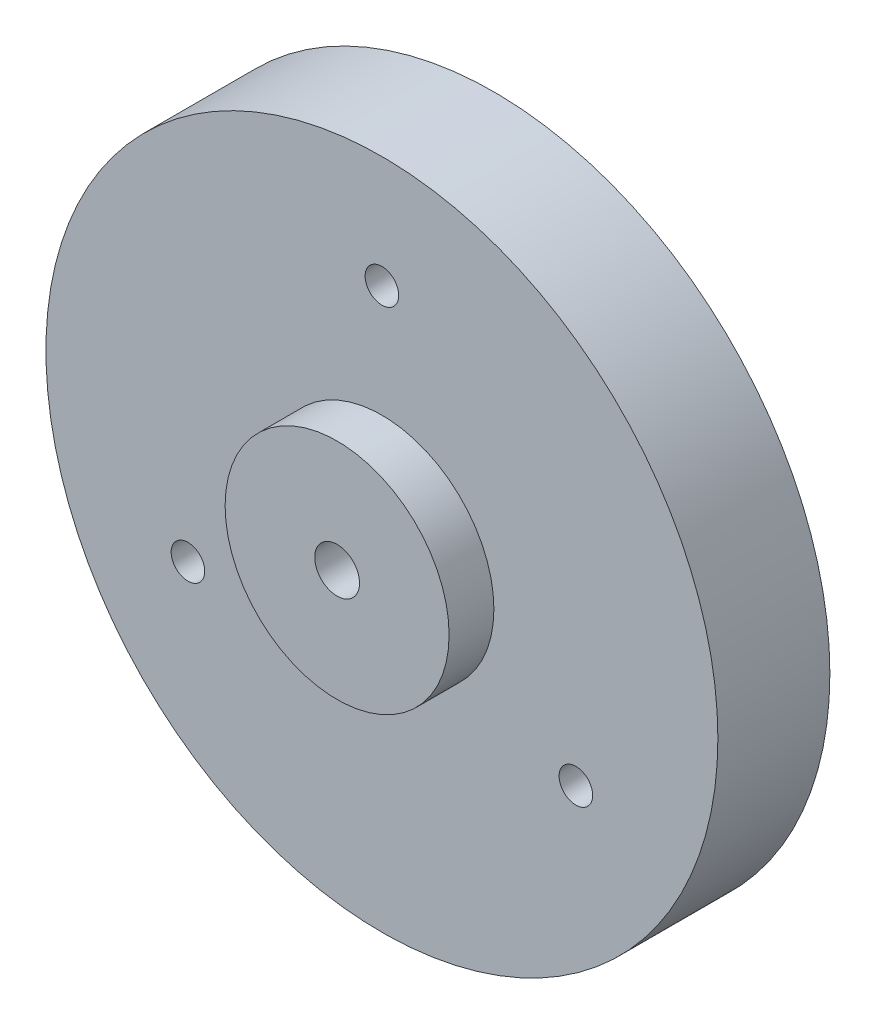
ISO-10303-21;
HEADER;
FILE_DESCRIPTION(('STEP AP214'),'2;1');
FILE_NAME('part.step','',(''),(''),'','','');
FILE_SCHEMA(('AUTOMOTIVE_DESIGN { 1 0 10303 214 1 1 1 1 }'));
ENDSEC;
DATA;
#1=APPLICATION_CONTEXT('core data for automotive mechanical design processes');
#2=APPLICATION_PROTOCOL_DEFINITION('international standard','automotive_design',2000,#1);
#3=PRODUCT_CONTEXT('',#1,'mechanical');
#4=PRODUCT('Part','Part','',(#3));
#5=PRODUCT_RELATED_PRODUCT_CATEGORY('part','',(#4));
#6=PRODUCT_DEFINITION_FORMATION('','',#4);
#7=PRODUCT_DEFINITION_CONTEXT('part definition',#1,'design');
#8=PRODUCT_DEFINITION('design','',#6,#7);
#9=PRODUCT_DEFINITION_SHAPE('','',#8);
#10=(LENGTH_UNIT() NAMED_UNIT(*) SI_UNIT(.MILLI.,.METRE.));
#11=(NAMED_UNIT(*) PLANE_ANGLE_UNIT() SI_UNIT($,.RADIAN.));
#12=(NAMED_UNIT(*) SI_UNIT($,.STERADIAN.) SOLID_ANGLE_UNIT());
#13=UNCERTAINTY_MEASURE_WITH_UNIT(LENGTH_MEASURE(1.E-05),#10,'distance_accuracy_value','');
#14=(GEOMETRIC_REPRESENTATION_CONTEXT(3) GLOBAL_UNCERTAINTY_ASSIGNED_CONTEXT((#13)) GLOBAL_UNIT_ASSIGNED_CONTEXT((#10,
#11,#12)) REPRESENTATION_CONTEXT('',''));
#15=CARTESIAN_POINT('',(0.,0.,0.));
#16=DIRECTION('',(0.,0.,1.));
#17=DIRECTION('',(1.,0.,0.));
#18=AXIS2_PLACEMENT_3D('',#15,#16,#17);
#19=CARTESIAN_POINT('',(0.,0.,16.25));
#20=DIRECTION('',(0.,0.,-1.));
#21=DIRECTION('',(-1.,0.,0.));
#22=AXIS2_PLACEMENT_3D('',#19,#20,#21);
#23=CYLINDRICAL_SURFACE('',#22,7.50000000000002);
#24=CARTESIAN_POINT('',(0.,0.,16.25));
#25=DIRECTION('',(0.,0.,1.));
#26=DIRECTION('',(1.,0.,0.));
#27=AXIS2_PLACEMENT_3D('',#24,#25,#26);
#28=CIRCLE('',#27,7.50000000000002);
#29=CARTESIAN_POINT('',(7.50000000000002,0.,16.25));
#30=VERTEX_POINT('',#29);
#31=EDGE_CURVE('E51',#30,#30,#28,.T.);
#32=ORIENTED_EDGE('',*,*,#31,.F.);
#33=EDGE_LOOP('',(#32));
#34=FACE_BOUND('',#33,.T.);
#35=CARTESIAN_POINT('',(0.,0.,13.75));
#36=DIRECTION('',(0.,0.,1.));
#37=DIRECTION('',(1.,0.,0.));
#38=AXIS2_PLACEMENT_3D('',#35,#36,#37);
#39=CIRCLE('',#38,7.50000000000002);
#40=CARTESIAN_POINT('',(7.50000000000002,0.,13.75));
#41=VERTEX_POINT('',#40);
#42=EDGE_CURVE('E46',#41,#41,#39,.T.);
#43=ORIENTED_EDGE('',*,*,#42,.T.);
#44=EDGE_LOOP('',(#43));
#45=FACE_BOUND('',#44,.T.);
#46=ADVANCED_FACE('F38',(#34,#45),#23,.T.);
#47=CARTESIAN_POINT('',(0.,0.,16.25));
#48=DIRECTION('',(0.,0.,1.));
#49=DIRECTION('',(1.,0.,0.));
#50=AXIS2_PLACEMENT_3D('',#47,#48,#49);
#51=PLANE('',#50);
#52=CARTESIAN_POINT('',(0.,5.,16.25));
#53=DIRECTION('',(0.,0.,1.));
#54=DIRECTION('',(1.,0.,0.));
#55=AXIS2_PLACEMENT_3D('',#52,#53,#54);
#56=CIRCLE('',#55,0.375);
#57=CARTESIAN_POINT('',(0.375,5.,16.25));
#58=VERTEX_POINT('',#57);
#59=EDGE_CURVE('E81',#58,#58,#56,.T.);
#60=ORIENTED_EDGE('',*,*,#59,.F.);
#61=EDGE_LOOP('',(#60));
#62=FACE_BOUND('',#61,.T.);
#63=CARTESIAN_POINT('',(4.33012701892251,-2.49999999999982,16.25));
#64=DIRECTION('',(0.,0.,1.));
#65=DIRECTION('',(1.,0.,0.));
#66=AXIS2_PLACEMENT_3D('',#63,#64,#65);
#67=CIRCLE('',#66,0.375000000000273);
#68=CARTESIAN_POINT('',(4.70512701892279,-2.49999999999982,16.25));
#69=VERTEX_POINT('',#68);
#70=EDGE_CURVE('E78',#69,#69,#67,.T.);
#71=ORIENTED_EDGE('',*,*,#70,.F.);
#72=EDGE_LOOP('',(#71));
#73=FACE_BOUND('',#72,.T.);
#74=CARTESIAN_POINT('',(-4.33012701892188,-2.50000000000018,16.25));
#75=DIRECTION('',(0.,0.,1.));
#76=DIRECTION('',(1.,0.,0.));
#77=AXIS2_PLACEMENT_3D('',#74,#75,#76);
#78=CIRCLE('',#77,0.375000000000399);
#79=CARTESIAN_POINT('',(-3.95512701892148,-2.50000000000018,16.25));
#80=VERTEX_POINT('',#79);
#81=EDGE_CURVE('E72',#80,#80,#78,.T.);
#82=ORIENTED_EDGE('',*,*,#81,.F.);
#83=EDGE_LOOP('',(#82));
#84=FACE_BOUND('',#83,.T.);
#85=CARTESIAN_POINT('',(0.,0.,16.25));
#86=DIRECTION('',(0.,0.,1.));
#87=DIRECTION('',(1.,0.,0.));
#88=AXIS2_PLACEMENT_3D('',#85,#86,#87);
#89=CIRCLE('',#88,2.49999999999988);
#90=CARTESIAN_POINT('',(2.49999999999988,0.,16.25));
#91=VERTEX_POINT('',#90);
#92=EDGE_CURVE('E10',#91,#91,#89,.T.);
#93=ORIENTED_EDGE('',*,*,#92,.F.);
#94=EDGE_LOOP('',(#93));
#95=FACE_BOUND('',#94,.T.);
#96=ORIENTED_EDGE('',*,*,#31,.T.);
#97=EDGE_LOOP('',(#96));
#98=FACE_BOUND('',#97,.T.);
#99=ADVANCED_FACE('F96',(#62,#73,#84,#95,#98),#51,.T.);
#100=CARTESIAN_POINT('',(0.,0.,13.75));
#101=DIRECTION('',(0.,0.,1.));
#102=DIRECTION('',(1.,0.,0.));
#103=AXIS2_PLACEMENT_3D('',#100,#101,#102);
#104=PLANE('',#103);
#105=CARTESIAN_POINT('',(0.,5.,13.75));
#106=DIRECTION('',(0.,0.,1.));
#107=DIRECTION('',(1.,0.,0.));
#108=AXIS2_PLACEMENT_3D('',#105,#106,#107);
#109=CIRCLE('',#108,0.375);
#110=CARTESIAN_POINT('',(0.375,5.,13.75));
#111=VERTEX_POINT('',#110);
#112=EDGE_CURVE('E67',#111,#111,#109,.T.);
#113=ORIENTED_EDGE('',*,*,#112,.T.);
#114=EDGE_LOOP('',(#113));
#115=FACE_BOUND('',#114,.T.);
#116=CARTESIAN_POINT('',(4.33012701892251,-2.49999999999982,13.75));
#117=DIRECTION('',(0.,0.,1.));
#118=DIRECTION('',(1.,0.,0.));
#119=AXIS2_PLACEMENT_3D('',#116,#117,#118);
#120=CIRCLE('',#119,0.375000000000273);
#121=CARTESIAN_POINT('',(4.70512701892279,-2.49999999999982,13.75));
#122=VERTEX_POINT('',#121);
#123=EDGE_CURVE('E75',#122,#122,#120,.T.);
#124=ORIENTED_EDGE('',*,*,#123,.T.);
#125=EDGE_LOOP('',(#124));
#126=FACE_BOUND('',#125,.T.);
#127=CARTESIAN_POINT('',(-4.33012701892188,-2.50000000000018,13.75));
#128=DIRECTION('',(0.,0.,1.));
#129=DIRECTION('',(1.,0.,0.));
#130=AXIS2_PLACEMENT_3D('',#127,#128,#129);
#131=CIRCLE('',#130,0.375000000000399);
#132=CARTESIAN_POINT('',(-3.95512701892148,-2.50000000000018,13.75));
#133=VERTEX_POINT('',#132);
#134=EDGE_CURVE('E69',#133,#133,#131,.T.);
#135=ORIENTED_EDGE('',*,*,#134,.T.);
#136=EDGE_LOOP('',(#135));
#137=FACE_BOUND('',#136,.T.);
#138=CARTESIAN_POINT('',(0.,0.,13.75));
#139=DIRECTION('',(0.,0.,1.));
#140=DIRECTION('',(1.,0.,0.));
#141=AXIS2_PLACEMENT_3D('',#138,#139,#140);
#142=CIRCLE('',#141,0.5);
#143=CARTESIAN_POINT('',(0.5,0.,13.75));
#144=VERTEX_POINT('',#143);
#145=EDGE_CURVE('E60',#144,#144,#142,.T.);
#146=ORIENTED_EDGE('',*,*,#145,.T.);
#147=EDGE_LOOP('',(#146));
#148=FACE_BOUND('',#147,.T.);
#149=ORIENTED_EDGE('',*,*,#42,.F.);
#150=EDGE_LOOP('',(#149));
#151=FACE_BOUND('',#150,.T.);
#152=ADVANCED_FACE('F40',(#115,#126,#137,#148,#151),#104,.F.);
#153=CARTESIAN_POINT('',(0.,0.,17.25));
#154=DIRECTION('',(0.,0.,-1.));
#155=DIRECTION('',(-1.,0.,0.));
#156=AXIS2_PLACEMENT_3D('',#153,#154,#155);
#157=CYLINDRICAL_SURFACE('',#156,2.49999999999988);
#158=CARTESIAN_POINT('',(0.,0.,17.25));
#159=DIRECTION('',(0.,0.,1.));
#160=DIRECTION('',(1.,0.,0.));
#161=AXIS2_PLACEMENT_3D('',#158,#159,#160);
#162=CIRCLE('',#161,2.49999999999988);
#163=CARTESIAN_POINT('',(2.49999999999988,0.,17.25));
#164=VERTEX_POINT('',#163);
#165=EDGE_CURVE('E54',#164,#164,#162,.T.);
#166=ORIENTED_EDGE('',*,*,#165,.F.);
#167=EDGE_LOOP('',(#166));
#168=FACE_BOUND('',#167,.T.);
#169=ORIENTED_EDGE('',*,*,#92,.T.);
#170=EDGE_LOOP('',(#169));
#171=FACE_BOUND('',#170,.T.);
#172=ADVANCED_FACE('F129',(#168,#171),#157,.T.);
#173=CARTESIAN_POINT('',(0.,0.,17.25));
#174=DIRECTION('',(0.,0.,1.));
#175=DIRECTION('',(1.,0.,0.));
#176=AXIS2_PLACEMENT_3D('',#173,#174,#175);
#177=PLANE('',#176);
#178=CARTESIAN_POINT('',(0.,0.,17.25));
#179=DIRECTION('',(0.,0.,1.));
#180=DIRECTION('',(1.,0.,0.));
#181=AXIS2_PLACEMENT_3D('',#178,#179,#180);
#182=CIRCLE('',#181,0.5);
#183=CARTESIAN_POINT('',(0.5,0.,17.25));
#184=VERTEX_POINT('',#183);
#185=EDGE_CURVE('E42',#184,#184,#182,.T.);
#186=ORIENTED_EDGE('',*,*,#185,.F.);
#187=EDGE_LOOP('',(#186));
#188=FACE_BOUND('',#187,.T.);
#189=ORIENTED_EDGE('',*,*,#165,.T.);
#190=EDGE_LOOP('',(#189));
#191=FACE_BOUND('',#190,.T.);
#192=ADVANCED_FACE('F116',(#188,#191),#177,.T.);
#193=CARTESIAN_POINT('',(0.,0.,-135.25));
#194=DIRECTION('',(0.,0.,1.));
#195=DIRECTION('',(1.,0.,0.));
#196=AXIS2_PLACEMENT_3D('',#193,#194,#195);
#197=CYLINDRICAL_SURFACE('',#196,0.5);
#198=ORIENTED_EDGE('',*,*,#185,.T.);
#199=EDGE_LOOP('',(#198));
#200=FACE_BOUND('',#199,.T.);
#201=ORIENTED_EDGE('',*,*,#145,.F.);
#202=EDGE_LOOP('',(#201));
#203=FACE_BOUND('',#202,.T.);
#204=ADVANCED_FACE('F106',(#200,#203),#197,.F.);
#205=CARTESIAN_POINT('',(-4.33012701892188,-2.50000000000018,13.75));
#206=DIRECTION('',(0.,0.,1.));
#207=DIRECTION('',(1.,0.,0.));
#208=AXIS2_PLACEMENT_3D('',#205,#206,#207);
#209=CYLINDRICAL_SURFACE('',#208,0.375000000000399);
#210=ORIENTED_EDGE('',*,*,#134,.F.);
#211=EDGE_LOOP('',(#210));
#212=FACE_BOUND('',#211,.T.);
#213=ORIENTED_EDGE('',*,*,#81,.T.);
#214=EDGE_LOOP('',(#213));
#215=FACE_BOUND('',#214,.T.);
#216=ADVANCED_FACE('F104',(#212,#215),#209,.F.);
#217=CARTESIAN_POINT('',(4.33012701892251,-2.49999999999982,13.75));
#218=DIRECTION('',(0.,0.,1.));
#219=DIRECTION('',(1.,0.,0.));
#220=AXIS2_PLACEMENT_3D('',#217,#218,#219);
#221=CYLINDRICAL_SURFACE('',#220,0.375000000000273);
#222=ORIENTED_EDGE('',*,*,#123,.F.);
#223=EDGE_LOOP('',(#222));
#224=FACE_BOUND('',#223,.T.);
#225=ORIENTED_EDGE('',*,*,#70,.T.);
#226=EDGE_LOOP('',(#225));
#227=FACE_BOUND('',#226,.T.);
#228=ADVANCED_FACE('F92',(#224,#227),#221,.F.);
#229=CARTESIAN_POINT('',(0.,5.,13.75));
#230=DIRECTION('',(0.,0.,1.));
#231=DIRECTION('',(1.,0.,0.));
#232=AXIS2_PLACEMENT_3D('',#229,#230,#231);
#233=CYLINDRICAL_SURFACE('',#232,0.375);
#234=ORIENTED_EDGE('',*,*,#112,.F.);
#235=EDGE_LOOP('',(#234));
#236=FACE_BOUND('',#235,.T.);
#237=ORIENTED_EDGE('',*,*,#59,.T.);
#238=EDGE_LOOP('',(#237));
#239=FACE_BOUND('',#238,.T.);
#240=ADVANCED_FACE('F89',(#236,#239),#233,.F.);
#241=CLOSED_SHELL('',(#46,#99,#152,#172,#192,#204,#216,#228,#240));
#242=MANIFOLD_SOLID_BREP('B2',#241);
#243=ADVANCED_BREP_SHAPE_REPRESENTATION('',(#18,#242),#14);
#244=SHAPE_DEFINITION_REPRESENTATION(#9,#243);
ENDSEC;
END-ISO-10303-21;
